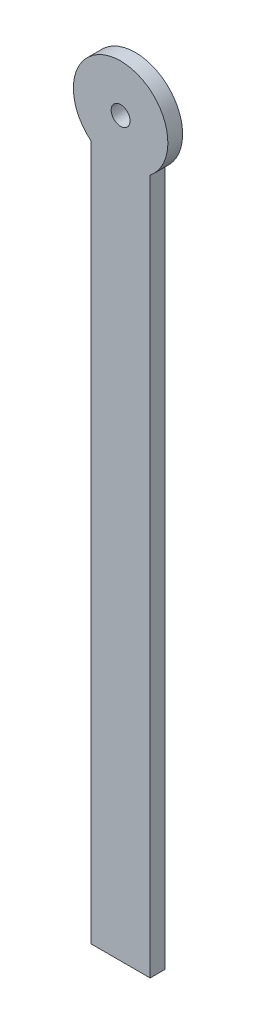
ISO-10303-21;
HEADER;
FILE_DESCRIPTION(('STEP AP214'),'2;1');
FILE_NAME('part.step','',(''),(''),'','','');
FILE_SCHEMA(('AUTOMOTIVE_DESIGN { 1 0 10303 214 1 1 1 1 }'));
ENDSEC;
DATA;
#1=APPLICATION_CONTEXT('core data for automotive mechanical design processes');
#2=APPLICATION_PROTOCOL_DEFINITION('international standard','automotive_design',2000,#1);
#3=PRODUCT_CONTEXT('',#1,'mechanical');
#4=PRODUCT('Part','Part','',(#3));
#5=PRODUCT_RELATED_PRODUCT_CATEGORY('part','',(#4));
#6=PRODUCT_DEFINITION_FORMATION('','',#4);
#7=PRODUCT_DEFINITION_CONTEXT('part definition',#1,'design');
#8=PRODUCT_DEFINITION('design','',#6,#7);
#9=PRODUCT_DEFINITION_SHAPE('','',#8);
#10=(LENGTH_UNIT() NAMED_UNIT(*) SI_UNIT(.MILLI.,.METRE.));
#11=(NAMED_UNIT(*) PLANE_ANGLE_UNIT() SI_UNIT($,.RADIAN.));
#12=(NAMED_UNIT(*) SI_UNIT($,.STERADIAN.) SOLID_ANGLE_UNIT());
#13=UNCERTAINTY_MEASURE_WITH_UNIT(LENGTH_MEASURE(1.E-05),#10,'distance_accuracy_value','');
#14=(GEOMETRIC_REPRESENTATION_CONTEXT(3) GLOBAL_UNCERTAINTY_ASSIGNED_CONTEXT((#13)) GLOBAL_UNIT_ASSIGNED_CONTEXT((#10,
#11,#12)) REPRESENTATION_CONTEXT('',''));
#15=CARTESIAN_POINT('',(0.,0.,0.));
#16=DIRECTION('',(0.,0.,1.));
#17=DIRECTION('',(1.,0.,0.));
#18=AXIS2_PLACEMENT_3D('',#15,#16,#17);
#19=CARTESIAN_POINT('',(6.35,0.,3.175));
#20=DIRECTION('',(-1.,0.,0.));
#21=DIRECTION('',(0.,0.,1.));
#22=AXIS2_PLACEMENT_3D('',#19,#20,#21);
#23=PLANE('',#22);
#24=DIRECTION('',(0.,1.,0.));
#25=VECTOR('',#24,1.);
#26=CARTESIAN_POINT('',(6.35,0.,0.));
#27=LINE('',#26,#25);
#28=CARTESIAN_POINT('',(6.35,0.,0.));
#29=VERTEX_POINT('',#28);
#30=CARTESIAN_POINT('',(6.35,149.548852542034,0.));
#31=VERTEX_POINT('',#30);
#32=EDGE_CURVE('E86',#29,#31,#27,.T.);
#33=ORIENTED_EDGE('',*,*,#32,.T.);
#34=DIRECTION('',(0.,0.,1.));
#35=VECTOR('',#34,1.);
#36=CARTESIAN_POINT('',(6.35,149.548852542034,-28.7368195874213));
#37=LINE('',#36,#35);
#38=CARTESIAN_POINT('',(6.35,149.548852542034,3.175));
#39=VERTEX_POINT('',#38);
#40=EDGE_CURVE('E89',#31,#39,#37,.T.);
#41=ORIENTED_EDGE('',*,*,#40,.T.);
#42=DIRECTION('',(0.,1.,0.));
#43=VECTOR('',#42,1.);
#44=CARTESIAN_POINT('',(6.35,0.,3.175));
#45=LINE('',#44,#43);
#46=CARTESIAN_POINT('',(6.35,0.,3.175));
#47=VERTEX_POINT('',#46);
#48=EDGE_CURVE('E85',#47,#39,#45,.T.);
#49=ORIENTED_EDGE('',*,*,#48,.F.);
#50=DIRECTION('',(0.,0.,-1.));
#51=VECTOR('',#50,1.);
#52=CARTESIAN_POINT('',(6.35,0.,3.175));
#53=LINE('',#52,#51);
#54=EDGE_CURVE('E46',#47,#29,#53,.T.);
#55=ORIENTED_EDGE('',*,*,#54,.T.);
#56=EDGE_LOOP('',(#33,#41,#49,#55));
#57=FACE_BOUND('',#56,.T.);
#58=ADVANCED_FACE('F39',(#57),#23,.F.);
#59=CARTESIAN_POINT('',(-6.35,0.,3.175));
#60=DIRECTION('',(1.,0.,0.));
#61=DIRECTION('',(0.,0.,-1.));
#62=AXIS2_PLACEMENT_3D('',#59,#60,#61);
#63=PLANE('',#62);
#64=DIRECTION('',(0.,-1.,0.));
#65=VECTOR('',#64,1.);
#66=CARTESIAN_POINT('',(-6.35,0.,3.175));
#67=LINE('',#66,#65);
#68=CARTESIAN_POINT('',(-6.35,149.548852542034,3.175));
#69=VERTEX_POINT('',#68);
#70=CARTESIAN_POINT('',(-6.35,0.,3.175));
#71=VERTEX_POINT('',#70);
#72=EDGE_CURVE('E100',#69,#71,#67,.T.);
#73=ORIENTED_EDGE('',*,*,#72,.F.);
#74=DIRECTION('',(0.,0.,1.));
#75=VECTOR('',#74,1.);
#76=CARTESIAN_POINT('',(-6.35,149.548852542034,-28.7368195874213));
#77=LINE('',#76,#75);
#78=CARTESIAN_POINT('',(-6.35,149.548852542034,0.));
#79=VERTEX_POINT('',#78);
#80=EDGE_CURVE('E91',#69,#79,#77,.F.);
#81=ORIENTED_EDGE('',*,*,#80,.T.);
#82=DIRECTION('',(0.,-1.,0.));
#83=VECTOR('',#82,1.);
#84=CARTESIAN_POINT('',(-6.35,0.,0.));
#85=LINE('',#84,#83);
#86=CARTESIAN_POINT('',(-6.35,0.,0.));
#87=VERTEX_POINT('',#86);
#88=EDGE_CURVE('E84',#79,#87,#85,.T.);
#89=ORIENTED_EDGE('',*,*,#88,.T.);
#90=DIRECTION('',(0.,0.,-1.));
#91=VECTOR('',#90,1.);
#92=CARTESIAN_POINT('',(-6.35,0.,3.175));
#93=LINE('',#92,#91);
#94=EDGE_CURVE('E11',#71,#87,#93,.T.);
#95=ORIENTED_EDGE('',*,*,#94,.F.);
#96=EDGE_LOOP('',(#73,#81,#89,#95));
#97=FACE_BOUND('',#96,.T.);
#98=ADVANCED_FACE('F129',(#97),#63,.F.);
#99=CARTESIAN_POINT('',(6.35,0.,3.175));
#100=DIRECTION('',(0.,1.,0.));
#101=DIRECTION('',(0.,0.,1.));
#102=AXIS2_PLACEMENT_3D('',#99,#100,#101);
#103=PLANE('',#102);
#104=DIRECTION('',(1.,0.,0.));
#105=VECTOR('',#104,1.);
#106=CARTESIAN_POINT('',(6.35,0.,0.));
#107=LINE('',#106,#105);
#108=EDGE_CURVE('E74',#87,#29,#107,.T.);
#109=ORIENTED_EDGE('',*,*,#108,.T.);
#110=ORIENTED_EDGE('',*,*,#54,.F.);
#111=DIRECTION('',(1.,0.,0.));
#112=VECTOR('',#111,1.);
#113=CARTESIAN_POINT('',(6.35,0.,3.175));
#114=LINE('',#113,#112);
#115=EDGE_CURVE('E61',#71,#47,#114,.T.);
#116=ORIENTED_EDGE('',*,*,#115,.F.);
#117=ORIENTED_EDGE('',*,*,#94,.T.);
#118=EDGE_LOOP('',(#109,#110,#116,#117));
#119=FACE_BOUND('',#118,.T.);
#120=ADVANCED_FACE('F79',(#119),#103,.F.);
#121=CARTESIAN_POINT('',(0.,0.,3.175));
#122=DIRECTION('',(0.,0.,-1.));
#123=DIRECTION('',(-1.,0.,0.));
#124=AXIS2_PLACEMENT_3D('',#121,#122,#123);
#125=PLANE('',#124);
#126=CARTESIAN_POINT('',(0.,157.48,3.175));
#127=DIRECTION('',(0.,0.,1.));
#128=DIRECTION('',(1.,0.,0.));
#129=AXIS2_PLACEMENT_3D('',#126,#127,#128);
#130=CIRCLE('',#129,2.032);
#131=CARTESIAN_POINT('',(2.032,157.48,3.175));
#132=VERTEX_POINT('',#131);
#133=EDGE_CURVE('E106',#132,#132,#130,.T.);
#134=ORIENTED_EDGE('',*,*,#133,.F.);
#135=EDGE_LOOP('',(#134));
#136=FACE_BOUND('',#135,.T.);
#137=CARTESIAN_POINT('',(0.,157.48,3.175));
#138=DIRECTION('',(0.,0.,1.));
#139=DIRECTION('',(1.,0.,0.));
#140=AXIS2_PLACEMENT_3D('',#137,#138,#139);
#141=CIRCLE('',#140,10.16);
#142=EDGE_CURVE('E105',#39,#69,#141,.T.);
#143=ORIENTED_EDGE('',*,*,#142,.T.);
#144=ORIENTED_EDGE('',*,*,#72,.T.);
#145=ORIENTED_EDGE('',*,*,#115,.T.);
#146=ORIENTED_EDGE('',*,*,#48,.T.);
#147=EDGE_LOOP('',(#143,#144,#145,#146));
#148=FACE_BOUND('',#147,.T.);
#149=ADVANCED_FACE('F117',(#136,#148),#125,.F.);
#150=CARTESIAN_POINT('',(0.,0.,0.));
#151=DIRECTION('',(0.,0.,-1.));
#152=DIRECTION('',(-1.,0.,0.));
#153=AXIS2_PLACEMENT_3D('',#150,#151,#152);
#154=PLANE('',#153);
#155=CARTESIAN_POINT('',(0.,157.48,0.));
#156=DIRECTION('',(0.,0.,1.));
#157=DIRECTION('',(1.,0.,0.));
#158=AXIS2_PLACEMENT_3D('',#155,#156,#157);
#159=CIRCLE('',#158,2.032);
#160=CARTESIAN_POINT('',(2.032,157.48,0.));
#161=VERTEX_POINT('',#160);
#162=EDGE_CURVE('E104',#161,#161,#159,.T.);
#163=ORIENTED_EDGE('',*,*,#162,.T.);
#164=EDGE_LOOP('',(#163));
#165=FACE_BOUND('',#164,.T.);
#166=ORIENTED_EDGE('',*,*,#88,.F.);
#167=CARTESIAN_POINT('',(0.,157.48,0.));
#168=DIRECTION('',(0.,0.,-1.));
#169=DIRECTION('',(-1.,0.,0.));
#170=AXIS2_PLACEMENT_3D('',#167,#168,#169);
#171=CIRCLE('',#170,10.16);
#172=EDGE_CURVE('E52',#31,#79,#171,.F.);
#173=ORIENTED_EDGE('',*,*,#172,.F.);
#174=ORIENTED_EDGE('',*,*,#32,.F.);
#175=ORIENTED_EDGE('',*,*,#108,.F.);
#176=EDGE_LOOP('',(#166,#173,#174,#175));
#177=FACE_BOUND('',#176,.T.);
#178=ADVANCED_FACE('F90',(#165,#177),#154,.T.);
#179=CARTESIAN_POINT('',(0.,157.48,-28.7368195874213));
#180=DIRECTION('',(0.,0.,1.));
#181=DIRECTION('',(1.,0.,0.));
#182=AXIS2_PLACEMENT_3D('',#179,#180,#181);
#183=CYLINDRICAL_SURFACE('',#182,10.16);
#184=ORIENTED_EDGE('',*,*,#40,.F.);
#185=ORIENTED_EDGE('',*,*,#172,.T.);
#186=ORIENTED_EDGE('',*,*,#80,.F.);
#187=ORIENTED_EDGE('',*,*,#142,.F.);
#188=EDGE_LOOP('',(#184,#185,#186,#187));
#189=FACE_BOUND('',#188,.T.);
#190=ADVANCED_FACE('F119',(#189),#183,.T.);
#191=CARTESIAN_POINT('',(0.,157.48,0.));
#192=DIRECTION('',(0.,0.,1.));
#193=DIRECTION('',(1.,0.,0.));
#194=AXIS2_PLACEMENT_3D('',#191,#192,#193);
#195=CYLINDRICAL_SURFACE('',#194,2.032);
#196=ORIENTED_EDGE('',*,*,#162,.F.);
#197=EDGE_LOOP('',(#196));
#198=FACE_BOUND('',#197,.T.);
#199=ORIENTED_EDGE('',*,*,#133,.T.);
#200=EDGE_LOOP('',(#199));
#201=FACE_BOUND('',#200,.T.);
#202=ADVANCED_FACE('F114',(#198,#201),#195,.F.);
#203=CLOSED_SHELL('',(#58,#98,#120,#149,#178,#190,#202));
#204=MANIFOLD_SOLID_BREP('B2',#203);
#205=ADVANCED_BREP_SHAPE_REPRESENTATION('',(#18,#204),#14);
#206=SHAPE_DEFINITION_REPRESENTATION(#9,#205);
ENDSEC;
END-ISO-10303-21;
